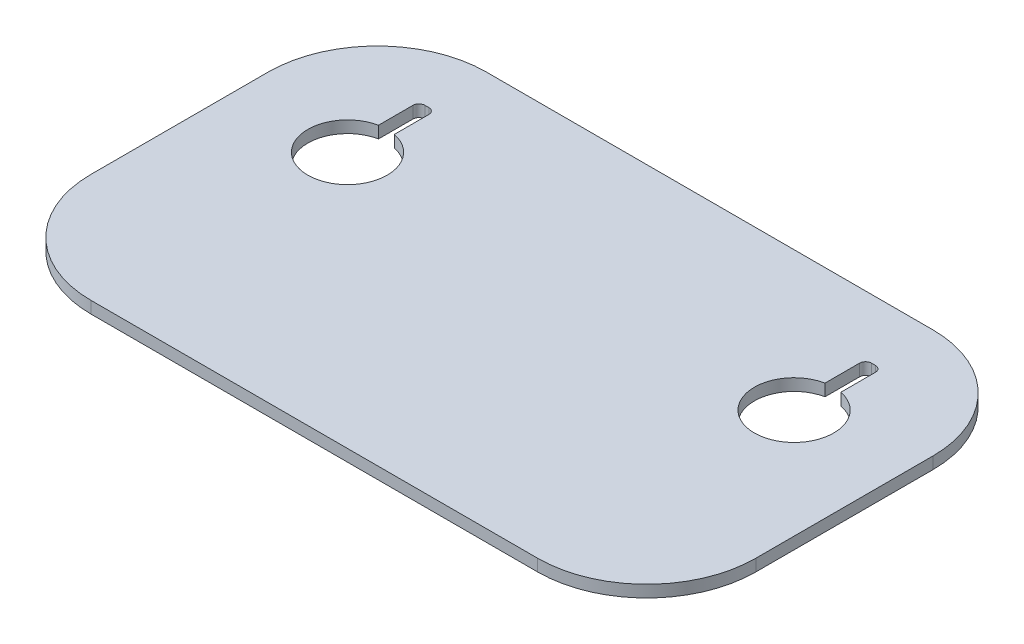
ISO-10303-21;
HEADER;
FILE_DESCRIPTION(('STEP AP214'),'2;1');
FILE_NAME('part.step','',(''),(''),'','','');
FILE_SCHEMA(('AUTOMOTIVE_DESIGN { 1 0 10303 214 1 1 1 1 }'));
ENDSEC;
DATA;
#1=APPLICATION_CONTEXT('core data for automotive mechanical design processes');
#2=APPLICATION_PROTOCOL_DEFINITION('international standard','automotive_design',2000,#1);
#3=PRODUCT_CONTEXT('',#1,'mechanical');
#4=PRODUCT('Part','Part','',(#3));
#5=PRODUCT_RELATED_PRODUCT_CATEGORY('part','',(#4));
#6=PRODUCT_DEFINITION_FORMATION('','',#4);
#7=PRODUCT_DEFINITION_CONTEXT('part definition',#1,'design');
#8=PRODUCT_DEFINITION('design','',#6,#7);
#9=PRODUCT_DEFINITION_SHAPE('','',#8);
#10=(LENGTH_UNIT() NAMED_UNIT(*) SI_UNIT(.MILLI.,.METRE.));
#11=(NAMED_UNIT(*) PLANE_ANGLE_UNIT() SI_UNIT($,.RADIAN.));
#12=(NAMED_UNIT(*) SI_UNIT($,.STERADIAN.) SOLID_ANGLE_UNIT());
#13=UNCERTAINTY_MEASURE_WITH_UNIT(LENGTH_MEASURE(1.E-05),#10,'distance_accuracy_value','');
#14=(GEOMETRIC_REPRESENTATION_CONTEXT(3) GLOBAL_UNCERTAINTY_ASSIGNED_CONTEXT((#13)) GLOBAL_UNIT_ASSIGNED_CONTEXT((#10,
#11,#12)) REPRESENTATION_CONTEXT('',''));
#15=CARTESIAN_POINT('',(0.,0.,0.));
#16=DIRECTION('',(0.,0.,1.));
#17=DIRECTION('',(1.,0.,0.));
#18=AXIS2_PLACEMENT_3D('',#15,#16,#17);
#19=CARTESIAN_POINT('',(-9.96657769260599,6.,116.272985598524));
#20=DIRECTION('',(0.,-1.,0.));
#21=DIRECTION('',(0.,0.,-1.));
#22=AXIS2_PLACEMENT_3D('',#19,#20,#21);
#23=CYLINDRICAL_SURFACE('',#22,55.);
#24=CARTESIAN_POINT('',(-9.96657769260599,0.,116.272985598524));
#25=DIRECTION('',(0.,1.,0.));
#26=DIRECTION('',(0.,0.,1.));
#27=AXIS2_PLACEMENT_3D('',#24,#25,#26);
#28=CIRCLE('',#27,55.);
#29=CARTESIAN_POINT('',(-64.966577692606,0.,116.272985598524));
#30=VERTEX_POINT('',#29);
#31=CARTESIAN_POINT('',(-9.9665776926056,0.,171.272985598524));
#32=VERTEX_POINT('',#31);
#33=EDGE_CURVE('E228',#30,#32,#28,.T.);
#34=ORIENTED_EDGE('',*,*,#33,.T.);
#35=DIRECTION('',(0.,-1.,0.));
#36=VECTOR('',#35,1.);
#37=CARTESIAN_POINT('',(-9.9665776926056,6.,171.272985598524));
#38=LINE('',#37,#36);
#39=CARTESIAN_POINT('',(-9.9665776926056,6.,171.272985598524));
#40=VERTEX_POINT('',#39);
#41=EDGE_CURVE('E293',#40,#32,#38,.T.);
#42=ORIENTED_EDGE('',*,*,#41,.F.);
#43=CARTESIAN_POINT('',(-9.96657769260599,6.,116.272985598524));
#44=DIRECTION('',(0.,1.,0.));
#45=DIRECTION('',(0.,0.,1.));
#46=AXIS2_PLACEMENT_3D('',#43,#44,#45);
#47=CIRCLE('',#46,55.);
#48=CARTESIAN_POINT('',(-64.966577692606,6.,116.272985598524));
#49=VERTEX_POINT('',#48);
#50=EDGE_CURVE('E239',#49,#40,#47,.T.);
#51=ORIENTED_EDGE('',*,*,#50,.F.);
#52=DIRECTION('',(0.,-1.,0.));
#53=VECTOR('',#52,1.);
#54=CARTESIAN_POINT('',(-64.966577692606,6.,116.272985598524));
#55=LINE('',#54,#53);
#56=EDGE_CURVE('E257',#49,#30,#55,.T.);
#57=ORIENTED_EDGE('',*,*,#56,.T.);
#58=EDGE_LOOP('',(#34,#42,#51,#57));
#59=FACE_BOUND('',#58,.T.);
#60=ADVANCED_FACE('F33',(#59),#23,.T.);
#61=CARTESIAN_POINT('',(-9.9665776926056,6.,171.272985598524));
#62=DIRECTION('',(0.,0.,-1.));
#63=DIRECTION('',(-1.,0.,0.));
#64=AXIS2_PLACEMENT_3D('',#61,#62,#63);
#65=PLANE('',#64);
#66=DIRECTION('',(1.,0.,0.));
#67=VECTOR('',#66,1.);
#68=CARTESIAN_POINT('',(-9.9665776926056,0.,171.272985598524));
#69=LINE('',#68,#67);
#70=CARTESIAN_POINT('',(215.063422307394,0.,171.272985598524));
#71=VERTEX_POINT('',#70);
#72=EDGE_CURVE('E260',#32,#71,#69,.T.);
#73=ORIENTED_EDGE('',*,*,#72,.T.);
#74=DIRECTION('',(0.,-1.,0.));
#75=VECTOR('',#74,1.);
#76=CARTESIAN_POINT('',(215.063422307394,6.,171.272985598524));
#77=LINE('',#76,#75);
#78=CARTESIAN_POINT('',(215.063422307394,6.,171.272985598524));
#79=VERTEX_POINT('',#78);
#80=EDGE_CURVE('E290',#79,#71,#77,.T.);
#81=ORIENTED_EDGE('',*,*,#80,.F.);
#82=DIRECTION('',(1.,0.,0.));
#83=VECTOR('',#82,1.);
#84=CARTESIAN_POINT('',(-9.9665776926056,6.,171.272985598524));
#85=LINE('',#84,#83);
#86=EDGE_CURVE('E242',#40,#79,#85,.T.);
#87=ORIENTED_EDGE('',*,*,#86,.F.);
#88=ORIENTED_EDGE('',*,*,#41,.T.);
#89=EDGE_LOOP('',(#73,#81,#87,#88));
#90=FACE_BOUND('',#89,.T.);
#91=ADVANCED_FACE('F351',(#90),#65,.F.);
#92=CARTESIAN_POINT('',(215.063422307394,6.,116.272985598524));
#93=DIRECTION('',(0.,-1.,0.));
#94=DIRECTION('',(0.,0.,-1.));
#95=AXIS2_PLACEMENT_3D('',#92,#93,#94);
#96=CYLINDRICAL_SURFACE('',#95,55.);
#97=CARTESIAN_POINT('',(215.063422307394,0.,116.272985598524));
#98=DIRECTION('',(0.,1.,0.));
#99=DIRECTION('',(0.,0.,1.));
#100=AXIS2_PLACEMENT_3D('',#97,#98,#99);
#101=CIRCLE('',#100,55.);
#102=CARTESIAN_POINT('',(270.063422307394,0.,116.272985598524));
#103=VERTEX_POINT('',#102);
#104=EDGE_CURVE('E262',#71,#103,#101,.T.);
#105=ORIENTED_EDGE('',*,*,#104,.T.);
#106=DIRECTION('',(0.,-1.,0.));
#107=VECTOR('',#106,1.);
#108=CARTESIAN_POINT('',(270.063422307394,6.,116.272985598524));
#109=LINE('',#108,#107);
#110=CARTESIAN_POINT('',(270.063422307394,6.,116.272985598524));
#111=VERTEX_POINT('',#110);
#112=EDGE_CURVE('E287',#111,#103,#109,.T.);
#113=ORIENTED_EDGE('',*,*,#112,.F.);
#114=CARTESIAN_POINT('',(215.063422307394,6.,116.272985598524));
#115=DIRECTION('',(0.,1.,0.));
#116=DIRECTION('',(0.,0.,1.));
#117=AXIS2_PLACEMENT_3D('',#114,#115,#116);
#118=CIRCLE('',#117,55.);
#119=EDGE_CURVE('E245',#79,#111,#118,.T.);
#120=ORIENTED_EDGE('',*,*,#119,.F.);
#121=ORIENTED_EDGE('',*,*,#80,.T.);
#122=EDGE_LOOP('',(#105,#113,#120,#121));
#123=FACE_BOUND('',#122,.T.);
#124=ADVANCED_FACE('F356',(#123),#96,.T.);
#125=CARTESIAN_POINT('',(270.063422307394,6.,27.0129855985246));
#126=DIRECTION('',(-1.,0.,0.));
#127=DIRECTION('',(0.,0.,1.));
#128=AXIS2_PLACEMENT_3D('',#125,#126,#127);
#129=PLANE('',#128);
#130=DIRECTION('',(0.,0.,-1.));
#131=VECTOR('',#130,1.);
#132=CARTESIAN_POINT('',(270.063422307394,0.,27.0129855985246));
#133=LINE('',#132,#131);
#134=CARTESIAN_POINT('',(270.063422307394,0.,27.0129855985246));
#135=VERTEX_POINT('',#134);
#136=EDGE_CURVE('E264',#103,#135,#133,.T.);
#137=ORIENTED_EDGE('',*,*,#136,.T.);
#138=DIRECTION('',(0.,-1.,0.));
#139=VECTOR('',#138,1.);
#140=CARTESIAN_POINT('',(270.063422307394,6.,27.0129855985246));
#141=LINE('',#140,#139);
#142=CARTESIAN_POINT('',(270.063422307394,6.,27.0129855985246));
#143=VERTEX_POINT('',#142);
#144=EDGE_CURVE('E284',#143,#135,#141,.T.);
#145=ORIENTED_EDGE('',*,*,#144,.F.);
#146=DIRECTION('',(0.,0.,-1.));
#147=VECTOR('',#146,1.);
#148=CARTESIAN_POINT('',(270.063422307394,6.,27.0129855985246));
#149=LINE('',#148,#147);
#150=EDGE_CURVE('E247',#111,#143,#149,.T.);
#151=ORIENTED_EDGE('',*,*,#150,.F.);
#152=ORIENTED_EDGE('',*,*,#112,.T.);
#153=EDGE_LOOP('',(#137,#145,#151,#152));
#154=FACE_BOUND('',#153,.T.);
#155=ADVANCED_FACE('F390',(#154),#129,.F.);
#156=CARTESIAN_POINT('',(215.063422307394,6.,27.0129855985242));
#157=DIRECTION('',(0.,-1.,0.));
#158=DIRECTION('',(0.,0.,-1.));
#159=AXIS2_PLACEMENT_3D('',#156,#157,#158);
#160=CYLINDRICAL_SURFACE('',#159,55.);
#161=CARTESIAN_POINT('',(215.063422307394,0.,27.0129855985242));
#162=DIRECTION('',(0.,1.,0.));
#163=DIRECTION('',(0.,0.,-1.));
#164=AXIS2_PLACEMENT_3D('',#161,#162,#163);
#165=CIRCLE('',#164,55.);
#166=CARTESIAN_POINT('',(215.063422307394,0.,-27.9870144014757));
#167=VERTEX_POINT('',#166);
#168=EDGE_CURVE('E266',#135,#167,#165,.T.);
#169=ORIENTED_EDGE('',*,*,#168,.T.);
#170=DIRECTION('',(0.,-1.,0.));
#171=VECTOR('',#170,1.);
#172=CARTESIAN_POINT('',(215.063422307394,6.,-27.9870144014757));
#173=LINE('',#172,#171);
#174=CARTESIAN_POINT('',(215.063422307394,6.,-27.9870144014757));
#175=VERTEX_POINT('',#174);
#176=EDGE_CURVE('E281',#175,#167,#173,.T.);
#177=ORIENTED_EDGE('',*,*,#176,.F.);
#178=CARTESIAN_POINT('',(215.063422307394,6.,27.0129855985242));
#179=DIRECTION('',(0.,1.,0.));
#180=DIRECTION('',(0.,0.,-1.));
#181=AXIS2_PLACEMENT_3D('',#178,#179,#180);
#182=CIRCLE('',#181,55.);
#183=EDGE_CURVE('E249',#143,#175,#182,.T.);
#184=ORIENTED_EDGE('',*,*,#183,.F.);
#185=ORIENTED_EDGE('',*,*,#144,.T.);
#186=EDGE_LOOP('',(#169,#177,#184,#185));
#187=FACE_BOUND('',#186,.T.);
#188=ADVANCED_FACE('F386',(#187),#160,.T.);
#189=CARTESIAN_POINT('',(-9.96657769260564,6.,-27.9870144014757));
#190=DIRECTION('',(0.,0.,1.));
#191=DIRECTION('',(1.,0.,0.));
#192=AXIS2_PLACEMENT_3D('',#189,#190,#191);
#193=PLANE('',#192);
#194=DIRECTION('',(-1.,0.,0.));
#195=VECTOR('',#194,1.);
#196=CARTESIAN_POINT('',(-9.96657769260564,0.,-27.9870144014757));
#197=LINE('',#196,#195);
#198=CARTESIAN_POINT('',(-9.96657769260564,0.,-27.9870144014757));
#199=VERTEX_POINT('',#198);
#200=EDGE_CURVE('E268',#167,#199,#197,.T.);
#201=ORIENTED_EDGE('',*,*,#200,.T.);
#202=DIRECTION('',(0.,-1.,0.));
#203=VECTOR('',#202,1.);
#204=CARTESIAN_POINT('',(-9.96657769260564,6.,-27.9870144014757));
#205=LINE('',#204,#203);
#206=CARTESIAN_POINT('',(-9.96657769260564,6.,-27.9870144014757));
#207=VERTEX_POINT('',#206);
#208=EDGE_CURVE('E278',#207,#199,#205,.T.);
#209=ORIENTED_EDGE('',*,*,#208,.F.);
#210=DIRECTION('',(-1.,0.,0.));
#211=VECTOR('',#210,1.);
#212=CARTESIAN_POINT('',(-9.96657769260564,6.,-27.9870144014757));
#213=LINE('',#212,#211);
#214=EDGE_CURVE('E251',#175,#207,#213,.T.);
#215=ORIENTED_EDGE('',*,*,#214,.F.);
#216=ORIENTED_EDGE('',*,*,#176,.T.);
#217=EDGE_LOOP('',(#201,#209,#215,#216));
#218=FACE_BOUND('',#217,.T.);
#219=ADVANCED_FACE('F381',(#218),#193,.F.);
#220=CARTESIAN_POINT('',(-9.96657769260602,6.,27.0129855985242));
#221=DIRECTION('',(0.,-1.,0.));
#222=DIRECTION('',(0.,0.,-1.));
#223=AXIS2_PLACEMENT_3D('',#220,#221,#222);
#224=CYLINDRICAL_SURFACE('',#223,55.);
#225=CARTESIAN_POINT('',(-9.96657769260602,0.,27.0129855985242));
#226=DIRECTION('',(0.,1.,0.));
#227=DIRECTION('',(0.,0.,1.));
#228=AXIS2_PLACEMENT_3D('',#225,#226,#227);
#229=CIRCLE('',#228,55.);
#230=CARTESIAN_POINT('',(-64.966577692606,0.,27.0129855985246));
#231=VERTEX_POINT('',#230);
#232=EDGE_CURVE('E270',#199,#231,#229,.T.);
#233=ORIENTED_EDGE('',*,*,#232,.T.);
#234=DIRECTION('',(0.,-1.,0.));
#235=VECTOR('',#234,1.);
#236=CARTESIAN_POINT('',(-64.966577692606,6.,27.0129855985246));
#237=LINE('',#236,#235);
#238=CARTESIAN_POINT('',(-64.966577692606,6.,27.0129855985246));
#239=VERTEX_POINT('',#238);
#240=EDGE_CURVE('E275',#239,#231,#237,.T.);
#241=ORIENTED_EDGE('',*,*,#240,.F.);
#242=CARTESIAN_POINT('',(-9.96657769260602,6.,27.0129855985242));
#243=DIRECTION('',(0.,1.,0.));
#244=DIRECTION('',(0.,0.,1.));
#245=AXIS2_PLACEMENT_3D('',#242,#243,#244);
#246=CIRCLE('',#245,55.);
#247=EDGE_CURVE('E253',#207,#239,#246,.T.);
#248=ORIENTED_EDGE('',*,*,#247,.F.);
#249=ORIENTED_EDGE('',*,*,#208,.T.);
#250=EDGE_LOOP('',(#233,#241,#248,#249));
#251=FACE_BOUND('',#250,.T.);
#252=ADVANCED_FACE('F376',(#251),#224,.T.);
#253=CARTESIAN_POINT('',(-64.966577692606,6.,27.0129855985246));
#254=DIRECTION('',(1.,0.,0.));
#255=DIRECTION('',(0.,0.,-1.));
#256=AXIS2_PLACEMENT_3D('',#253,#254,#255);
#257=PLANE('',#256);
#258=DIRECTION('',(0.,0.,1.));
#259=VECTOR('',#258,1.);
#260=CARTESIAN_POINT('',(-64.966577692606,0.,27.0129855985246));
#261=LINE('',#260,#259);
#262=EDGE_CURVE('E243',#231,#30,#261,.T.);
#263=ORIENTED_EDGE('',*,*,#262,.T.);
#264=ORIENTED_EDGE('',*,*,#56,.F.);
#265=DIRECTION('',(0.,0.,1.));
#266=VECTOR('',#265,1.);
#267=CARTESIAN_POINT('',(-64.966577692606,6.,27.0129855985246));
#268=LINE('',#267,#266);
#269=EDGE_CURVE('E255',#239,#49,#268,.T.);
#270=ORIENTED_EDGE('',*,*,#269,.F.);
#271=ORIENTED_EDGE('',*,*,#240,.T.);
#272=EDGE_LOOP('',(#263,#264,#270,#271));
#273=FACE_BOUND('',#272,.T.);
#274=ADVANCED_FACE('F374',(#273),#257,.F.);
#275=CARTESIAN_POINT('',(-9.96657769260599,6.,116.272985598524));
#276=DIRECTION('',(0.,1.,0.));
#277=DIRECTION('',(0.,0.,1.));
#278=AXIS2_PLACEMENT_3D('',#275,#276,#277);
#279=PLANE('',#278);
#280=CARTESIAN_POINT('',(215.063422307394,6.,42.0129855985243));
#281=DIRECTION('',(0.,1.,0.));
#282=DIRECTION('',(0.,0.,1.));
#283=AXIS2_PLACEMENT_3D('',#280,#281,#282);
#284=CIRCLE('',#283,20.);
#285=CARTESIAN_POINT('',(211.063422307394,6.,22.4170676562588));
#286=VERTEX_POINT('',#285);
#287=CARTESIAN_POINT('',(219.063422307394,6.,22.4170676562588));
#288=VERTEX_POINT('',#287);
#289=EDGE_CURVE('E47',#286,#288,#284,.T.);
#290=ORIENTED_EDGE('',*,*,#289,.F.);
#291=DIRECTION('',(0.,0.,1.));
#292=VECTOR('',#291,1.);
#293=CARTESIAN_POINT('',(211.063422307394,6.,5.01298559852426));
#294=LINE('',#293,#292);
#295=CARTESIAN_POINT('',(211.063422307394,6.,5.01298559852426));
#296=VERTEX_POINT('',#295);
#297=EDGE_CURVE('E197',#296,#286,#294,.T.);
#298=ORIENTED_EDGE('',*,*,#297,.F.);
#299=CARTESIAN_POINT('',(214.063422307394,6.,5.01298559852426));
#300=DIRECTION('',(0.,1.,0.));
#301=DIRECTION('',(0.,0.,1.));
#302=AXIS2_PLACEMENT_3D('',#299,#300,#301);
#303=CIRCLE('',#302,3.);
#304=CARTESIAN_POINT('',(214.063422307394,6.,2.01298559852426));
#305=VERTEX_POINT('',#304);
#306=EDGE_CURVE('E191',#305,#296,#303,.T.);
#307=ORIENTED_EDGE('',*,*,#306,.F.);
#308=DIRECTION('',(-1.,0.,0.));
#309=VECTOR('',#308,1.);
#310=CARTESIAN_POINT('',(214.063422307394,6.,2.01298559852426));
#311=LINE('',#310,#309);
#312=CARTESIAN_POINT('',(216.063422307394,6.,2.01298559852426));
#313=VERTEX_POINT('',#312);
#314=EDGE_CURVE('E189',#313,#305,#311,.T.);
#315=ORIENTED_EDGE('',*,*,#314,.F.);
#316=CARTESIAN_POINT('',(216.063422307394,6.,5.01298559852426));
#317=DIRECTION('',(0.,1.,0.));
#318=DIRECTION('',(0.,0.,-1.));
#319=AXIS2_PLACEMENT_3D('',#316,#317,#318);
#320=CIRCLE('',#319,3.);
#321=CARTESIAN_POINT('',(219.063422307394,6.,5.01298559852426));
#322=VERTEX_POINT('',#321);
#323=EDGE_CURVE('E172',#322,#313,#320,.T.);
#324=ORIENTED_EDGE('',*,*,#323,.F.);
#325=DIRECTION('',(0.,0.,-1.));
#326=VECTOR('',#325,1.);
#327=CARTESIAN_POINT('',(219.063422307394,6.,5.01298559852426));
#328=LINE('',#327,#326);
#329=EDGE_CURVE('E181',#288,#322,#328,.T.);
#330=ORIENTED_EDGE('',*,*,#329,.F.);
#331=EDGE_LOOP('',(#290,#298,#307,#315,#324,#330));
#332=FACE_BOUND('',#331,.T.);
#333=CARTESIAN_POINT('',(-9.96657769260598,6.,42.0129855985242));
#334=DIRECTION('',(0.,1.,0.));
#335=DIRECTION('',(0.,0.,1.));
#336=AXIS2_PLACEMENT_3D('',#333,#334,#335);
#337=CIRCLE('',#336,20.);
#338=CARTESIAN_POINT('',(-13.966577692606,6.,22.4170676562588));
#339=VERTEX_POINT('',#338);
#340=CARTESIAN_POINT('',(-5.96657769260597,6.,22.4170676562588));
#341=VERTEX_POINT('',#340);
#342=EDGE_CURVE('E202',#339,#341,#337,.T.);
#343=ORIENTED_EDGE('',*,*,#342,.F.);
#344=DIRECTION('',(0.,0.,1.));
#345=VECTOR('',#344,1.);
#346=CARTESIAN_POINT('',(-13.966577692606,6.,5.01298559852425));
#347=LINE('',#346,#345);
#348=CARTESIAN_POINT('',(-13.966577692606,6.,5.01298559852425));
#349=VERTEX_POINT('',#348);
#350=EDGE_CURVE('E222',#349,#339,#347,.T.);
#351=ORIENTED_EDGE('',*,*,#350,.F.);
#352=CARTESIAN_POINT('',(-10.966577692606,6.,5.01298559852425));
#353=DIRECTION('',(0.,1.,0.));
#354=DIRECTION('',(0.,0.,1.));
#355=AXIS2_PLACEMENT_3D('',#352,#353,#354);
#356=CIRCLE('',#355,3.);
#357=CARTESIAN_POINT('',(-10.966577692606,6.,2.01298559852425));
#358=VERTEX_POINT('',#357);
#359=EDGE_CURVE('E219',#358,#349,#356,.T.);
#360=ORIENTED_EDGE('',*,*,#359,.F.);
#361=DIRECTION('',(-1.,0.,0.));
#362=VECTOR('',#361,1.);
#363=CARTESIAN_POINT('',(-10.966577692606,6.,2.01298559852425));
#364=LINE('',#363,#362);
#365=CARTESIAN_POINT('',(-8.96657769260598,6.,2.01298559852425));
#366=VERTEX_POINT('',#365);
#367=EDGE_CURVE('E216',#366,#358,#364,.T.);
#368=ORIENTED_EDGE('',*,*,#367,.F.);
#369=CARTESIAN_POINT('',(-8.96657769260598,6.,5.01298559852425));
#370=DIRECTION('',(0.,1.,0.));
#371=DIRECTION('',(0.,0.,-1.));
#372=AXIS2_PLACEMENT_3D('',#369,#370,#371);
#373=CIRCLE('',#372,3.);
#374=CARTESIAN_POINT('',(-5.96657769260597,6.,5.01298559852425));
#375=VERTEX_POINT('',#374);
#376=EDGE_CURVE('E213',#375,#366,#373,.T.);
#377=ORIENTED_EDGE('',*,*,#376,.F.);
#378=DIRECTION('',(0.,0.,-1.));
#379=VECTOR('',#378,1.);
#380=CARTESIAN_POINT('',(-5.96657769260597,6.,5.01298559852425));
#381=LINE('',#380,#379);
#382=EDGE_CURVE('E210',#341,#375,#381,.T.);
#383=ORIENTED_EDGE('',*,*,#382,.F.);
#384=EDGE_LOOP('',(#343,#351,#360,#368,#377,#383));
#385=FACE_BOUND('',#384,.T.);
#386=ORIENTED_EDGE('',*,*,#50,.T.);
#387=ORIENTED_EDGE('',*,*,#86,.T.);
#388=ORIENTED_EDGE('',*,*,#119,.T.);
#389=ORIENTED_EDGE('',*,*,#150,.T.);
#390=ORIENTED_EDGE('',*,*,#183,.T.);
#391=ORIENTED_EDGE('',*,*,#214,.T.);
#392=ORIENTED_EDGE('',*,*,#247,.T.);
#393=ORIENTED_EDGE('',*,*,#269,.T.);
#394=EDGE_LOOP('',(#386,#387,#388,#389,#390,#391,#392,#393));
#395=FACE_BOUND('',#394,.T.);
#396=ADVANCED_FACE('F185',(#332,#385,#395),#279,.T.);
#397=CARTESIAN_POINT('',(-9.96657769260599,0.,116.272985598524));
#398=DIRECTION('',(0.,1.,0.));
#399=DIRECTION('',(0.,0.,1.));
#400=AXIS2_PLACEMENT_3D('',#397,#398,#399);
#401=PLANE('',#400);
#402=DIRECTION('',(0.,0.,1.));
#403=VECTOR('',#402,1.);
#404=CARTESIAN_POINT('',(211.063422307394,0.,116.272985598524));
#405=LINE('',#404,#403);
#406=CARTESIAN_POINT('',(211.063422307394,0.,5.01298559852426));
#407=VERTEX_POINT('',#406);
#408=CARTESIAN_POINT('',(211.063422307394,0.,22.4170676562588));
#409=VERTEX_POINT('',#408);
#410=EDGE_CURVE('E40',#407,#409,#405,.T.);
#411=ORIENTED_EDGE('',*,*,#410,.T.);
#412=CARTESIAN_POINT('',(215.063422307394,0.,42.0129855985243));
#413=DIRECTION('',(0.,1.,0.));
#414=DIRECTION('',(0.,0.,1.));
#415=AXIS2_PLACEMENT_3D('',#412,#413,#414);
#416=CIRCLE('',#415,20.);
#417=CARTESIAN_POINT('',(219.063422307394,0.,22.4170676562588));
#418=VERTEX_POINT('',#417);
#419=EDGE_CURVE('E11',#409,#418,#416,.T.);
#420=ORIENTED_EDGE('',*,*,#419,.T.);
#421=DIRECTION('',(0.,0.,-1.));
#422=VECTOR('',#421,1.);
#423=CARTESIAN_POINT('',(219.063422307394,0.,116.272985598524));
#424=LINE('',#423,#422);
#425=CARTESIAN_POINT('',(219.063422307394,0.,5.01298559852427));
#426=VERTEX_POINT('',#425);
#427=EDGE_CURVE('E314',#418,#426,#424,.T.);
#428=ORIENTED_EDGE('',*,*,#427,.T.);
#429=CARTESIAN_POINT('',(216.063422307394,0.,5.01298559852426));
#430=DIRECTION('',(0.,1.,0.));
#431=DIRECTION('',(0.,0.,1.));
#432=AXIS2_PLACEMENT_3D('',#429,#430,#431);
#433=CIRCLE('',#432,3.);
#434=CARTESIAN_POINT('',(216.063422307394,0.,2.01298559852426));
#435=VERTEX_POINT('',#434);
#436=EDGE_CURVE('E175',#426,#435,#433,.T.);
#437=ORIENTED_EDGE('',*,*,#436,.T.);
#438=DIRECTION('',(-1.,0.,0.));
#439=VECTOR('',#438,1.);
#440=CARTESIAN_POINT('',(-9.96657769260599,0.,2.01298559852427));
#441=LINE('',#440,#439);
#442=CARTESIAN_POINT('',(214.063422307394,0.,2.01298559852426));
#443=VERTEX_POINT('',#442);
#444=EDGE_CURVE('E317',#435,#443,#441,.T.);
#445=ORIENTED_EDGE('',*,*,#444,.T.);
#446=CARTESIAN_POINT('',(214.063422307394,0.,5.01298559852426));
#447=DIRECTION('',(0.,1.,0.));
#448=DIRECTION('',(0.,0.,1.));
#449=AXIS2_PLACEMENT_3D('',#446,#447,#448);
#450=CIRCLE('',#449,3.);
#451=EDGE_CURVE('E320',#443,#407,#450,.T.);
#452=ORIENTED_EDGE('',*,*,#451,.T.);
#453=EDGE_LOOP('',(#411,#420,#428,#437,#445,#452));
#454=FACE_BOUND('',#453,.T.);
#455=DIRECTION('',(0.,0.,1.));
#456=VECTOR('',#455,1.);
#457=CARTESIAN_POINT('',(-13.966577692606,0.,116.272985598524));
#458=LINE('',#457,#456);
#459=CARTESIAN_POINT('',(-13.966577692606,0.,5.01298559852425));
#460=VERTEX_POINT('',#459);
#461=CARTESIAN_POINT('',(-13.966577692606,0.,22.4170676562588));
#462=VERTEX_POINT('',#461);
#463=EDGE_CURVE('E308',#460,#462,#458,.T.);
#464=ORIENTED_EDGE('',*,*,#463,.T.);
#465=CARTESIAN_POINT('',(-9.96657769260598,0.,42.0129855985242));
#466=DIRECTION('',(0.,1.,0.));
#467=DIRECTION('',(0.,0.,1.));
#468=AXIS2_PLACEMENT_3D('',#465,#466,#467);
#469=CIRCLE('',#468,20.);
#470=CARTESIAN_POINT('',(-5.96657769260597,0.,22.4170676562588));
#471=VERTEX_POINT('',#470);
#472=EDGE_CURVE('E311',#462,#471,#469,.T.);
#473=ORIENTED_EDGE('',*,*,#472,.T.);
#474=DIRECTION('',(0.,0.,-1.));
#475=VECTOR('',#474,1.);
#476=CARTESIAN_POINT('',(-5.96657769260597,0.,116.272985598524));
#477=LINE('',#476,#475);
#478=CARTESIAN_POINT('',(-5.96657769260597,0.,5.01298559852426));
#479=VERTEX_POINT('',#478);
#480=EDGE_CURVE('E296',#471,#479,#477,.T.);
#481=ORIENTED_EDGE('',*,*,#480,.T.);
#482=CARTESIAN_POINT('',(-8.96657769260598,0.,5.01298559852425));
#483=DIRECTION('',(0.,1.,0.));
#484=DIRECTION('',(0.,0.,1.));
#485=AXIS2_PLACEMENT_3D('',#482,#483,#484);
#486=CIRCLE('',#485,3.);
#487=CARTESIAN_POINT('',(-8.96657769260598,0.,2.01298559852425));
#488=VERTEX_POINT('',#487);
#489=EDGE_CURVE('E299',#479,#488,#486,.T.);
#490=ORIENTED_EDGE('',*,*,#489,.T.);
#491=DIRECTION('',(-1.,0.,0.));
#492=VECTOR('',#491,1.);
#493=CARTESIAN_POINT('',(-9.96657769260599,0.,2.01298559852424));
#494=LINE('',#493,#492);
#495=CARTESIAN_POINT('',(-10.966577692606,0.,2.01298559852425));
#496=VERTEX_POINT('',#495);
#497=EDGE_CURVE('E302',#488,#496,#494,.T.);
#498=ORIENTED_EDGE('',*,*,#497,.T.);
#499=CARTESIAN_POINT('',(-10.966577692606,0.,5.01298559852425));
#500=DIRECTION('',(0.,1.,0.));
#501=DIRECTION('',(0.,0.,1.));
#502=AXIS2_PLACEMENT_3D('',#499,#500,#501);
#503=CIRCLE('',#502,3.);
#504=EDGE_CURVE('E305',#496,#460,#503,.T.);
#505=ORIENTED_EDGE('',*,*,#504,.T.);
#506=EDGE_LOOP('',(#464,#473,#481,#490,#498,#505));
#507=FACE_BOUND('',#506,.T.);
#508=ORIENTED_EDGE('',*,*,#33,.F.);
#509=ORIENTED_EDGE('',*,*,#262,.F.);
#510=ORIENTED_EDGE('',*,*,#232,.F.);
#511=ORIENTED_EDGE('',*,*,#200,.F.);
#512=ORIENTED_EDGE('',*,*,#168,.F.);
#513=ORIENTED_EDGE('',*,*,#136,.F.);
#514=ORIENTED_EDGE('',*,*,#104,.F.);
#515=ORIENTED_EDGE('',*,*,#72,.F.);
#516=EDGE_LOOP('',(#508,#509,#510,#511,#512,#513,#514,#515));
#517=FACE_BOUND('',#516,.T.);
#518=ADVANCED_FACE('F324',(#454,#507,#517),#401,.F.);
#519=CARTESIAN_POINT('',(-9.96657769260598,-274.,42.0129855985242));
#520=DIRECTION('',(0.,1.,0.));
#521=DIRECTION('',(0.,0.,1.));
#522=AXIS2_PLACEMENT_3D('',#519,#520,#521);
#523=CYLINDRICAL_SURFACE('',#522,20.);
#524=DIRECTION('',(0.,1.,0.));
#525=VECTOR('',#524,1.);
#526=CARTESIAN_POINT('',(-13.966577692606,-274.,22.4170676562588));
#527=LINE('',#526,#525);
#528=EDGE_CURVE('E226',#462,#339,#527,.T.);
#529=ORIENTED_EDGE('',*,*,#528,.T.);
#530=ORIENTED_EDGE('',*,*,#342,.T.);
#531=DIRECTION('',(0.,1.,0.));
#532=VECTOR('',#531,1.);
#533=CARTESIAN_POINT('',(-5.96657769260597,-274.,22.4170676562588));
#534=LINE('',#533,#532);
#535=EDGE_CURVE('E225',#471,#341,#534,.T.);
#536=ORIENTED_EDGE('',*,*,#535,.F.);
#537=ORIENTED_EDGE('',*,*,#472,.F.);
#538=EDGE_LOOP('',(#529,#530,#536,#537));
#539=FACE_BOUND('',#538,.T.);
#540=ADVANCED_FACE('F410',(#539),#523,.F.);
#541=CARTESIAN_POINT('',(-13.966577692606,-274.,5.01298559852425));
#542=DIRECTION('',(-1.,0.,0.));
#543=DIRECTION('',(0.,0.,1.));
#544=AXIS2_PLACEMENT_3D('',#541,#542,#543);
#545=PLANE('',#544);
#546=DIRECTION('',(0.,1.,0.));
#547=VECTOR('',#546,1.);
#548=CARTESIAN_POINT('',(-13.966577692606,-274.,5.01298559852425));
#549=LINE('',#548,#547);
#550=EDGE_CURVE('E229',#460,#349,#549,.T.);
#551=ORIENTED_EDGE('',*,*,#550,.T.);
#552=ORIENTED_EDGE('',*,*,#350,.T.);
#553=ORIENTED_EDGE('',*,*,#528,.F.);
#554=ORIENTED_EDGE('',*,*,#463,.F.);
#555=EDGE_LOOP('',(#551,#552,#553,#554));
#556=FACE_BOUND('',#555,.T.);
#557=ADVANCED_FACE('F414',(#556),#545,.F.);
#558=CARTESIAN_POINT('',(-10.966577692606,-274.,5.01298559852425));
#559=DIRECTION('',(0.,1.,0.));
#560=DIRECTION('',(0.,0.,1.));
#561=AXIS2_PLACEMENT_3D('',#558,#559,#560);
#562=CYLINDRICAL_SURFACE('',#561,3.);
#563=DIRECTION('',(0.,1.,0.));
#564=VECTOR('',#563,1.);
#565=CARTESIAN_POINT('',(-10.966577692606,-274.,2.01298559852425));
#566=LINE('',#565,#564);
#567=EDGE_CURVE('E231',#496,#358,#566,.T.);
#568=ORIENTED_EDGE('',*,*,#567,.T.);
#569=ORIENTED_EDGE('',*,*,#359,.T.);
#570=ORIENTED_EDGE('',*,*,#550,.F.);
#571=ORIENTED_EDGE('',*,*,#504,.F.);
#572=EDGE_LOOP('',(#568,#569,#570,#571));
#573=FACE_BOUND('',#572,.T.);
#574=ADVANCED_FACE('F423',(#573),#562,.F.);
#575=CARTESIAN_POINT('',(-10.966577692606,-274.,2.01298559852425));
#576=DIRECTION('',(0.,0.,-1.));
#577=DIRECTION('',(-1.,0.,0.));
#578=AXIS2_PLACEMENT_3D('',#575,#576,#577);
#579=PLANE('',#578);
#580=DIRECTION('',(0.,1.,0.));
#581=VECTOR('',#580,1.);
#582=CARTESIAN_POINT('',(-8.96657769260598,-274.,2.01298559852425));
#583=LINE('',#582,#581);
#584=EDGE_CURVE('E233',#488,#366,#583,.T.);
#585=ORIENTED_EDGE('',*,*,#584,.T.);
#586=ORIENTED_EDGE('',*,*,#367,.T.);
#587=ORIENTED_EDGE('',*,*,#567,.F.);
#588=ORIENTED_EDGE('',*,*,#497,.F.);
#589=EDGE_LOOP('',(#585,#586,#587,#588));
#590=FACE_BOUND('',#589,.T.);
#591=ADVANCED_FACE('F419',(#590),#579,.F.);
#592=CARTESIAN_POINT('',(-8.96657769260598,-274.,5.01298559852425));
#593=DIRECTION('',(0.,1.,0.));
#594=DIRECTION('',(0.,0.,1.));
#595=AXIS2_PLACEMENT_3D('',#592,#593,#594);
#596=CYLINDRICAL_SURFACE('',#595,3.);
#597=DIRECTION('',(0.,1.,0.));
#598=VECTOR('',#597,1.);
#599=CARTESIAN_POINT('',(-5.96657769260597,-274.,5.01298559852425));
#600=LINE('',#599,#598);
#601=EDGE_CURVE('E235',#479,#375,#600,.T.);
#602=ORIENTED_EDGE('',*,*,#601,.T.);
#603=ORIENTED_EDGE('',*,*,#376,.T.);
#604=ORIENTED_EDGE('',*,*,#584,.F.);
#605=ORIENTED_EDGE('',*,*,#489,.F.);
#606=EDGE_LOOP('',(#602,#603,#604,#605));
#607=FACE_BOUND('',#606,.T.);
#608=ADVANCED_FACE('F345',(#607),#596,.F.);
#609=CARTESIAN_POINT('',(-5.96657769260597,-274.,5.01298559852425));
#610=DIRECTION('',(1.,0.,0.));
#611=DIRECTION('',(0.,0.,-1.));
#612=AXIS2_PLACEMENT_3D('',#609,#610,#611);
#613=PLANE('',#612);
#614=ORIENTED_EDGE('',*,*,#535,.T.);
#615=ORIENTED_EDGE('',*,*,#382,.T.);
#616=ORIENTED_EDGE('',*,*,#601,.F.);
#617=ORIENTED_EDGE('',*,*,#480,.F.);
#618=EDGE_LOOP('',(#614,#615,#616,#617));
#619=FACE_BOUND('',#618,.T.);
#620=ADVANCED_FACE('F338',(#619),#613,.F.);
#621=CARTESIAN_POINT('',(215.063422307394,-274.,42.0129855985243));
#622=DIRECTION('',(0.,1.,0.));
#623=DIRECTION('',(0.,0.,1.));
#624=AXIS2_PLACEMENT_3D('',#621,#622,#623);
#625=CYLINDRICAL_SURFACE('',#624,20.);
#626=DIRECTION('',(0.,1.,0.));
#627=VECTOR('',#626,1.);
#628=CARTESIAN_POINT('',(211.063422307394,-274.,22.4170676562588));
#629=LINE('',#628,#627);
#630=EDGE_CURVE('E200',#409,#286,#629,.T.);
#631=ORIENTED_EDGE('',*,*,#630,.T.);
#632=ORIENTED_EDGE('',*,*,#289,.T.);
#633=DIRECTION('',(0.,1.,0.));
#634=VECTOR('',#633,1.);
#635=CARTESIAN_POINT('',(219.063422307394,-274.,22.4170676562588));
#636=LINE('',#635,#634);
#637=EDGE_CURVE('E178',#418,#288,#636,.T.);
#638=ORIENTED_EDGE('',*,*,#637,.F.);
#639=ORIENTED_EDGE('',*,*,#419,.F.);
#640=EDGE_LOOP('',(#631,#632,#638,#639));
#641=FACE_BOUND('',#640,.T.);
#642=ADVANCED_FACE('F336',(#641),#625,.F.);
#643=CARTESIAN_POINT('',(211.063422307394,-274.,5.01298559852426));
#644=DIRECTION('',(-1.,0.,0.));
#645=DIRECTION('',(0.,0.,1.));
#646=AXIS2_PLACEMENT_3D('',#643,#644,#645);
#647=PLANE('',#646);
#648=DIRECTION('',(0.,1.,0.));
#649=VECTOR('',#648,1.);
#650=CARTESIAN_POINT('',(211.063422307394,-274.,5.01298559852426));
#651=LINE('',#650,#649);
#652=EDGE_CURVE('E203',#407,#296,#651,.T.);
#653=ORIENTED_EDGE('',*,*,#652,.T.);
#654=ORIENTED_EDGE('',*,*,#297,.T.);
#655=ORIENTED_EDGE('',*,*,#630,.F.);
#656=ORIENTED_EDGE('',*,*,#410,.F.);
#657=EDGE_LOOP('',(#653,#654,#655,#656));
#658=FACE_BOUND('',#657,.T.);
#659=ADVANCED_FACE('F329',(#658),#647,.F.);
#660=CARTESIAN_POINT('',(214.063422307394,-274.,5.01298559852426));
#661=DIRECTION('',(0.,1.,0.));
#662=DIRECTION('',(0.,0.,1.));
#663=AXIS2_PLACEMENT_3D('',#660,#661,#662);
#664=CYLINDRICAL_SURFACE('',#663,3.);
#665=DIRECTION('',(0.,1.,0.));
#666=VECTOR('',#665,1.);
#667=CARTESIAN_POINT('',(214.063422307394,-274.,2.01298559852426));
#668=LINE('',#667,#666);
#669=EDGE_CURVE('E205',#443,#305,#668,.T.);
#670=ORIENTED_EDGE('',*,*,#669,.T.);
#671=ORIENTED_EDGE('',*,*,#306,.T.);
#672=ORIENTED_EDGE('',*,*,#652,.F.);
#673=ORIENTED_EDGE('',*,*,#451,.F.);
#674=EDGE_LOOP('',(#670,#671,#672,#673));
#675=FACE_BOUND('',#674,.T.);
#676=ADVANCED_FACE('F331',(#675),#664,.F.);
#677=CARTESIAN_POINT('',(214.063422307394,-274.,2.01298559852426));
#678=DIRECTION('',(0.,0.,-1.));
#679=DIRECTION('',(-1.,0.,0.));
#680=AXIS2_PLACEMENT_3D('',#677,#678,#679);
#681=PLANE('',#680);
#682=DIRECTION('',(0.,1.,0.));
#683=VECTOR('',#682,1.);
#684=CARTESIAN_POINT('',(216.063422307394,-274.,2.01298559852426));
#685=LINE('',#684,#683);
#686=EDGE_CURVE('E177',#435,#313,#685,.T.);
#687=ORIENTED_EDGE('',*,*,#686,.T.);
#688=ORIENTED_EDGE('',*,*,#314,.T.);
#689=ORIENTED_EDGE('',*,*,#669,.F.);
#690=ORIENTED_EDGE('',*,*,#444,.F.);
#691=EDGE_LOOP('',(#687,#688,#689,#690));
#692=FACE_BOUND('',#691,.T.);
#693=ADVANCED_FACE('F335',(#692),#681,.F.);
#694=CARTESIAN_POINT('',(216.063422307394,-274.,5.01298559852426));
#695=DIRECTION('',(0.,1.,0.));
#696=DIRECTION('',(0.,0.,1.));
#697=AXIS2_PLACEMENT_3D('',#694,#695,#696);
#698=CYLINDRICAL_SURFACE('',#697,3.);
#699=DIRECTION('',(0.,1.,0.));
#700=VECTOR('',#699,1.);
#701=CARTESIAN_POINT('',(219.063422307394,-274.,5.01298559852426));
#702=LINE('',#701,#700);
#703=EDGE_CURVE('E55',#426,#322,#702,.T.);
#704=ORIENTED_EDGE('',*,*,#703,.T.);
#705=ORIENTED_EDGE('',*,*,#323,.T.);
#706=ORIENTED_EDGE('',*,*,#686,.F.);
#707=ORIENTED_EDGE('',*,*,#436,.F.);
#708=EDGE_LOOP('',(#704,#705,#706,#707));
#709=FACE_BOUND('',#708,.T.);
#710=ADVANCED_FACE('F169',(#709),#698,.F.);
#711=CARTESIAN_POINT('',(219.063422307394,-274.,5.01298559852426));
#712=DIRECTION('',(1.,0.,0.));
#713=DIRECTION('',(0.,0.,-1.));
#714=AXIS2_PLACEMENT_3D('',#711,#712,#713);
#715=PLANE('',#714);
#716=ORIENTED_EDGE('',*,*,#637,.T.);
#717=ORIENTED_EDGE('',*,*,#329,.T.);
#718=ORIENTED_EDGE('',*,*,#703,.F.);
#719=ORIENTED_EDGE('',*,*,#427,.F.);
#720=EDGE_LOOP('',(#716,#717,#718,#719));
#721=FACE_BOUND('',#720,.T.);
#722=ADVANCED_FACE('F182',(#721),#715,.F.);
#723=CLOSED_SHELL('',(#60,#91,#124,#155,#188,#219,#252,#274,#396,#518,#540,#557,#574,#591,#608,
#620,#642,#659,#676,#693,#710,#722));
#724=MANIFOLD_SOLID_BREP('B2',#723);
#725=ADVANCED_BREP_SHAPE_REPRESENTATION('',(#18,#724),#14);
#726=SHAPE_DEFINITION_REPRESENTATION(#9,#725);
ENDSEC;
END-ISO-10303-21;
